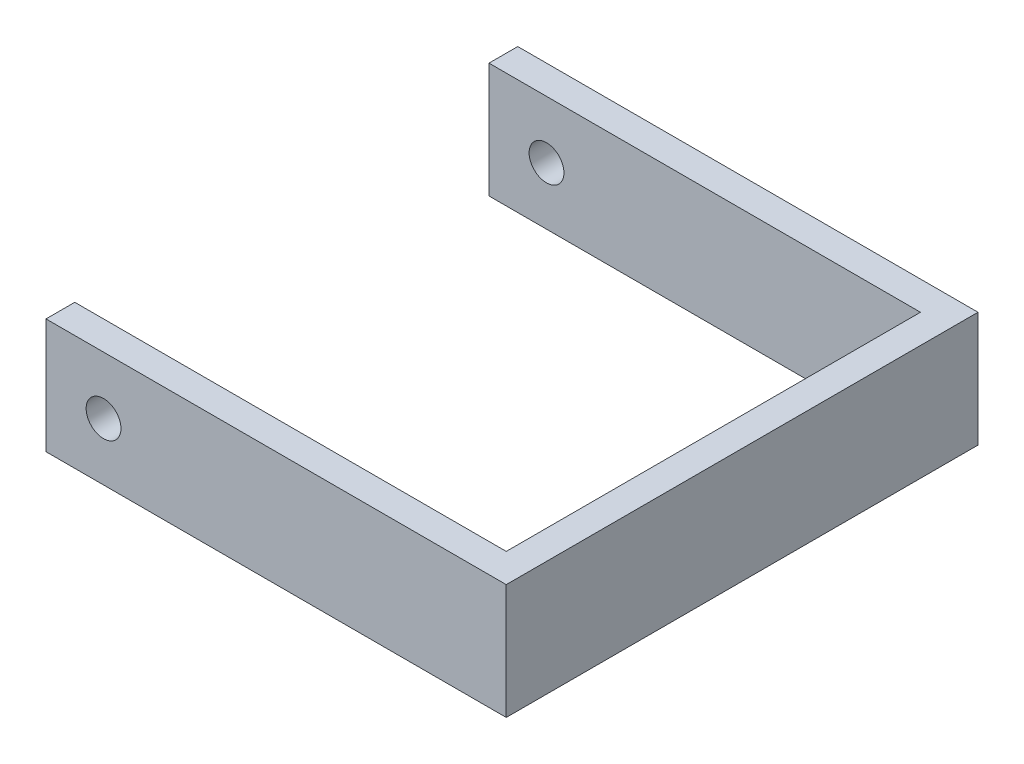
ISO-10303-21;
HEADER;
FILE_DESCRIPTION(('STEP AP214'),'2;1');
FILE_NAME('part.step','',(''),(''),'','','');
FILE_SCHEMA(('AUTOMOTIVE_DESIGN { 1 0 10303 214 1 1 1 1 }'));
ENDSEC;
DATA;
#1=APPLICATION_CONTEXT('core data for automotive mechanical design processes');
#2=APPLICATION_PROTOCOL_DEFINITION('international standard','automotive_design',2000,#1);
#3=PRODUCT_CONTEXT('',#1,'mechanical');
#4=PRODUCT('Part','Part','',(#3));
#5=PRODUCT_RELATED_PRODUCT_CATEGORY('part','',(#4));
#6=PRODUCT_DEFINITION_FORMATION('','',#4);
#7=PRODUCT_DEFINITION_CONTEXT('part definition',#1,'design');
#8=PRODUCT_DEFINITION('design','',#6,#7);
#9=PRODUCT_DEFINITION_SHAPE('','',#8);
#10=(LENGTH_UNIT() NAMED_UNIT(*) SI_UNIT(.MILLI.,.METRE.));
#11=(NAMED_UNIT(*) PLANE_ANGLE_UNIT() SI_UNIT($,.RADIAN.));
#12=(NAMED_UNIT(*) SI_UNIT($,.STERADIAN.) SOLID_ANGLE_UNIT());
#13=UNCERTAINTY_MEASURE_WITH_UNIT(LENGTH_MEASURE(1.E-05),#10,'distance_accuracy_value','');
#14=(GEOMETRIC_REPRESENTATION_CONTEXT(3) GLOBAL_UNCERTAINTY_ASSIGNED_CONTEXT((#13)) GLOBAL_UNIT_ASSIGNED_CONTEXT((#10,
#11,#12)) REPRESENTATION_CONTEXT('',''));
#15=CARTESIAN_POINT('',(0.,0.,0.));
#16=DIRECTION('',(0.,0.,1.));
#17=DIRECTION('',(1.,0.,0.));
#18=AXIS2_PLACEMENT_3D('',#15,#16,#17);
#19=CARTESIAN_POINT('',(-53.,20.,-36.));
#20=DIRECTION('',(1.,0.,0.));
#21=DIRECTION('',(0.,0.,-1.));
#22=AXIS2_PLACEMENT_3D('',#19,#20,#21);
#23=PLANE('',#22);
#24=DIRECTION('',(0.,0.,1.));
#25=VECTOR('',#24,1.);
#26=CARTESIAN_POINT('',(-53.,0.,-36.));
#27=LINE('',#26,#25);
#28=CARTESIAN_POINT('',(-53.,0.,-41.));
#29=VERTEX_POINT('',#28);
#30=CARTESIAN_POINT('',(-53.,0.,-36.));
#31=VERTEX_POINT('',#30);
#32=EDGE_CURVE('E129',#29,#31,#27,.T.);
#33=ORIENTED_EDGE('',*,*,#32,.T.);
#34=DIRECTION('',(0.,-1.,0.));
#35=VECTOR('',#34,1.);
#36=CARTESIAN_POINT('',(-53.,20.,-36.));
#37=LINE('',#36,#35);
#38=CARTESIAN_POINT('',(-53.,20.,-36.));
#39=VERTEX_POINT('',#38);
#40=EDGE_CURVE('E11',#39,#31,#37,.T.);
#41=ORIENTED_EDGE('',*,*,#40,.F.);
#42=DIRECTION('',(0.,0.,1.));
#43=VECTOR('',#42,1.);
#44=CARTESIAN_POINT('',(-53.,20.,-36.));
#45=LINE('',#44,#43);
#46=CARTESIAN_POINT('',(-53.,20.,-41.));
#47=VERTEX_POINT('',#46);
#48=EDGE_CURVE('E144',#47,#39,#45,.T.);
#49=ORIENTED_EDGE('',*,*,#48,.F.);
#50=DIRECTION('',(0.,-1.,0.));
#51=VECTOR('',#50,1.);
#52=CARTESIAN_POINT('',(-53.,20.,-41.));
#53=LINE('',#52,#51);
#54=EDGE_CURVE('E125',#47,#29,#53,.T.);
#55=ORIENTED_EDGE('',*,*,#54,.T.);
#56=EDGE_LOOP('',(#33,#41,#49,#55));
#57=FACE_BOUND('',#56,.T.);
#58=ADVANCED_FACE('F33',(#57),#23,.F.);
#59=CARTESIAN_POINT('',(22.,20.,-36.));
#60=DIRECTION('',(0.,0.,-1.));
#61=DIRECTION('',(-1.,0.,0.));
#62=AXIS2_PLACEMENT_3D('',#59,#60,#61);
#63=PLANE('',#62);
#64=CARTESIAN_POINT('',(-43.,10.,-36.));
#65=DIRECTION('',(0.,0.,-1.));
#66=DIRECTION('',(-1.,0.,0.));
#67=AXIS2_PLACEMENT_3D('',#64,#65,#66);
#68=CIRCLE('',#67,3.025);
#69=CARTESIAN_POINT('',(-46.025,10.,-36.));
#70=VERTEX_POINT('',#69);
#71=EDGE_CURVE('E182',#70,#70,#68,.F.);
#72=ORIENTED_EDGE('',*,*,#71,.F.);
#73=EDGE_LOOP('',(#72));
#74=FACE_BOUND('',#73,.T.);
#75=DIRECTION('',(1.,0.,0.));
#76=VECTOR('',#75,1.);
#77=CARTESIAN_POINT('',(22.,0.,-36.));
#78=LINE('',#77,#76);
#79=CARTESIAN_POINT('',(22.,0.,-36.));
#80=VERTEX_POINT('',#79);
#81=EDGE_CURVE('E132',#31,#80,#78,.T.);
#82=ORIENTED_EDGE('',*,*,#81,.T.);
#83=DIRECTION('',(0.,-1.,0.));
#84=VECTOR('',#83,1.);
#85=CARTESIAN_POINT('',(22.,20.,-36.));
#86=LINE('',#85,#84);
#87=CARTESIAN_POINT('',(22.,20.,-36.));
#88=VERTEX_POINT('',#87);
#89=EDGE_CURVE('E41',#88,#80,#86,.T.);
#90=ORIENTED_EDGE('',*,*,#89,.F.);
#91=DIRECTION('',(1.,0.,0.));
#92=VECTOR('',#91,1.);
#93=CARTESIAN_POINT('',(22.,20.,-36.));
#94=LINE('',#93,#92);
#95=EDGE_CURVE('E92',#39,#88,#94,.T.);
#96=ORIENTED_EDGE('',*,*,#95,.F.);
#97=ORIENTED_EDGE('',*,*,#40,.T.);
#98=EDGE_LOOP('',(#82,#90,#96,#97));
#99=FACE_BOUND('',#98,.T.);
#100=ADVANCED_FACE('F198',(#74,#99),#63,.F.);
#101=CARTESIAN_POINT('',(22.,20.,36.));
#102=DIRECTION('',(1.,0.,0.));
#103=DIRECTION('',(0.,0.,-1.));
#104=AXIS2_PLACEMENT_3D('',#101,#102,#103);
#105=PLANE('',#104);
#106=DIRECTION('',(0.,0.,1.));
#107=VECTOR('',#106,1.);
#108=CARTESIAN_POINT('',(22.,0.,36.));
#109=LINE('',#108,#107);
#110=CARTESIAN_POINT('',(22.,0.,36.));
#111=VERTEX_POINT('',#110);
#112=EDGE_CURVE('E135',#80,#111,#109,.T.);
#113=ORIENTED_EDGE('',*,*,#112,.T.);
#114=DIRECTION('',(0.,-1.,0.));
#115=VECTOR('',#114,1.);
#116=CARTESIAN_POINT('',(22.,20.,36.));
#117=LINE('',#116,#115);
#118=CARTESIAN_POINT('',(22.,20.,36.));
#119=VERTEX_POINT('',#118);
#120=EDGE_CURVE('E151',#119,#111,#117,.T.);
#121=ORIENTED_EDGE('',*,*,#120,.F.);
#122=DIRECTION('',(0.,0.,1.));
#123=VECTOR('',#122,1.);
#124=CARTESIAN_POINT('',(22.,20.,36.));
#125=LINE('',#124,#123);
#126=EDGE_CURVE('E159',#88,#119,#125,.T.);
#127=ORIENTED_EDGE('',*,*,#126,.F.);
#128=ORIENTED_EDGE('',*,*,#89,.T.);
#129=EDGE_LOOP('',(#113,#121,#127,#128));
#130=FACE_BOUND('',#129,.T.);
#131=ADVANCED_FACE('F157',(#130),#105,.F.);
#132=CARTESIAN_POINT('',(-53.,20.,36.));
#133=DIRECTION('',(0.,0.,1.));
#134=DIRECTION('',(1.,0.,0.));
#135=AXIS2_PLACEMENT_3D('',#132,#133,#134);
#136=PLANE('',#135);
#137=CARTESIAN_POINT('',(-43.,10.,36.));
#138=DIRECTION('',(0.,0.,1.));
#139=DIRECTION('',(1.,0.,0.));
#140=AXIS2_PLACEMENT_3D('',#137,#138,#139);
#141=CIRCLE('',#140,3.025);
#142=CARTESIAN_POINT('',(-39.975,10.,36.));
#143=VERTEX_POINT('',#142);
#144=EDGE_CURVE('E133',#143,#143,#141,.F.);
#145=ORIENTED_EDGE('',*,*,#144,.F.);
#146=EDGE_LOOP('',(#145));
#147=FACE_BOUND('',#146,.T.);
#148=DIRECTION('',(-1.,0.,0.));
#149=VECTOR('',#148,1.);
#150=CARTESIAN_POINT('',(-53.,0.,36.));
#151=LINE('',#150,#149);
#152=CARTESIAN_POINT('',(-53.,0.,36.));
#153=VERTEX_POINT('',#152);
#154=EDGE_CURVE('E137',#111,#153,#151,.T.);
#155=ORIENTED_EDGE('',*,*,#154,.T.);
#156=DIRECTION('',(0.,-1.,0.));
#157=VECTOR('',#156,1.);
#158=CARTESIAN_POINT('',(-53.,20.,36.));
#159=LINE('',#158,#157);
#160=CARTESIAN_POINT('',(-53.,20.,36.));
#161=VERTEX_POINT('',#160);
#162=EDGE_CURVE('E148',#161,#153,#159,.T.);
#163=ORIENTED_EDGE('',*,*,#162,.F.);
#164=DIRECTION('',(-1.,0.,0.));
#165=VECTOR('',#164,1.);
#166=CARTESIAN_POINT('',(-53.,20.,36.));
#167=LINE('',#166,#165);
#168=EDGE_CURVE('E171',#119,#161,#167,.T.);
#169=ORIENTED_EDGE('',*,*,#168,.F.);
#170=ORIENTED_EDGE('',*,*,#120,.T.);
#171=EDGE_LOOP('',(#155,#163,#169,#170));
#172=FACE_BOUND('',#171,.T.);
#173=ADVANCED_FACE('F167',(#147,#172),#136,.F.);
#174=CARTESIAN_POINT('',(-53.,20.,41.));
#175=DIRECTION('',(1.,0.,0.));
#176=DIRECTION('',(0.,0.,-1.));
#177=AXIS2_PLACEMENT_3D('',#174,#175,#176);
#178=PLANE('',#177);
#179=DIRECTION('',(0.,0.,1.));
#180=VECTOR('',#179,1.);
#181=CARTESIAN_POINT('',(-53.,0.,41.));
#182=LINE('',#181,#180);
#183=CARTESIAN_POINT('',(-53.,0.,41.));
#184=VERTEX_POINT('',#183);
#185=EDGE_CURVE('E139',#153,#184,#182,.T.);
#186=ORIENTED_EDGE('',*,*,#185,.T.);
#187=DIRECTION('',(0.,-1.,0.));
#188=VECTOR('',#187,1.);
#189=CARTESIAN_POINT('',(-53.,20.,41.));
#190=LINE('',#189,#188);
#191=CARTESIAN_POINT('',(-53.,20.,41.));
#192=VERTEX_POINT('',#191);
#193=EDGE_CURVE('E120',#192,#184,#190,.T.);
#194=ORIENTED_EDGE('',*,*,#193,.F.);
#195=DIRECTION('',(0.,0.,1.));
#196=VECTOR('',#195,1.);
#197=CARTESIAN_POINT('',(-53.,20.,41.));
#198=LINE('',#197,#196);
#199=EDGE_CURVE('E111',#161,#192,#198,.T.);
#200=ORIENTED_EDGE('',*,*,#199,.F.);
#201=ORIENTED_EDGE('',*,*,#162,.T.);
#202=EDGE_LOOP('',(#186,#194,#200,#201));
#203=FACE_BOUND('',#202,.T.);
#204=ADVANCED_FACE('F170',(#203),#178,.F.);
#205=CARTESIAN_POINT('',(27.,20.,41.));
#206=DIRECTION('',(0.,0.,-1.));
#207=DIRECTION('',(-1.,0.,0.));
#208=AXIS2_PLACEMENT_3D('',#205,#206,#207);
#209=PLANE('',#208);
#210=CARTESIAN_POINT('',(-43.,10.,41.));
#211=DIRECTION('',(0.,0.,1.));
#212=DIRECTION('',(1.,0.,0.));
#213=AXIS2_PLACEMENT_3D('',#210,#211,#212);
#214=CIRCLE('',#213,3.025);
#215=CARTESIAN_POINT('',(-39.975,10.,41.));
#216=VERTEX_POINT('',#215);
#217=EDGE_CURVE('E179',#216,#216,#214,.T.);
#218=ORIENTED_EDGE('',*,*,#217,.F.);
#219=EDGE_LOOP('',(#218));
#220=FACE_BOUND('',#219,.T.);
#221=DIRECTION('',(1.,0.,0.));
#222=VECTOR('',#221,1.);
#223=CARTESIAN_POINT('',(27.,0.,41.));
#224=LINE('',#223,#222);
#225=CARTESIAN_POINT('',(27.,0.,41.));
#226=VERTEX_POINT('',#225);
#227=EDGE_CURVE('E119',#184,#226,#224,.T.);
#228=ORIENTED_EDGE('',*,*,#227,.T.);
#229=DIRECTION('',(0.,-1.,0.));
#230=VECTOR('',#229,1.);
#231=CARTESIAN_POINT('',(27.,20.,41.));
#232=LINE('',#231,#230);
#233=CARTESIAN_POINT('',(27.,20.,41.));
#234=VERTEX_POINT('',#233);
#235=EDGE_CURVE('E116',#234,#226,#232,.T.);
#236=ORIENTED_EDGE('',*,*,#235,.F.);
#237=DIRECTION('',(1.,0.,0.));
#238=VECTOR('',#237,1.);
#239=CARTESIAN_POINT('',(27.,20.,41.));
#240=LINE('',#239,#238);
#241=EDGE_CURVE('E105',#192,#234,#240,.T.);
#242=ORIENTED_EDGE('',*,*,#241,.F.);
#243=ORIENTED_EDGE('',*,*,#193,.T.);
#244=EDGE_LOOP('',(#228,#236,#242,#243));
#245=FACE_BOUND('',#244,.T.);
#246=ADVANCED_FACE('F117',(#220,#245),#209,.F.);
#247=CARTESIAN_POINT('',(27.,20.,-41.));
#248=DIRECTION('',(-1.,0.,0.));
#249=DIRECTION('',(0.,0.,1.));
#250=AXIS2_PLACEMENT_3D('',#247,#248,#249);
#251=PLANE('',#250);
#252=DIRECTION('',(0.,0.,-1.));
#253=VECTOR('',#252,1.);
#254=CARTESIAN_POINT('',(27.,0.,-41.));
#255=LINE('',#254,#253);
#256=CARTESIAN_POINT('',(27.,0.,-41.));
#257=VERTEX_POINT('',#256);
#258=EDGE_CURVE('E78',#226,#257,#255,.T.);
#259=ORIENTED_EDGE('',*,*,#258,.T.);
#260=DIRECTION('',(0.,-1.,0.));
#261=VECTOR('',#260,1.);
#262=CARTESIAN_POINT('',(27.,20.,-41.));
#263=LINE('',#262,#261);
#264=CARTESIAN_POINT('',(27.,20.,-41.));
#265=VERTEX_POINT('',#264);
#266=EDGE_CURVE('E121',#265,#257,#263,.T.);
#267=ORIENTED_EDGE('',*,*,#266,.F.);
#268=DIRECTION('',(0.,0.,-1.));
#269=VECTOR('',#268,1.);
#270=CARTESIAN_POINT('',(27.,20.,-41.));
#271=LINE('',#270,#269);
#272=EDGE_CURVE('E109',#234,#265,#271,.T.);
#273=ORIENTED_EDGE('',*,*,#272,.F.);
#274=ORIENTED_EDGE('',*,*,#235,.T.);
#275=EDGE_LOOP('',(#259,#267,#273,#274));
#276=FACE_BOUND('',#275,.T.);
#277=ADVANCED_FACE('F123',(#276),#251,.F.);
#278=CARTESIAN_POINT('',(-53.,20.,-41.));
#279=DIRECTION('',(0.,0.,1.));
#280=DIRECTION('',(1.,0.,0.));
#281=AXIS2_PLACEMENT_3D('',#278,#279,#280);
#282=PLANE('',#281);
#283=CARTESIAN_POINT('',(-43.,10.,-41.));
#284=DIRECTION('',(0.,0.,1.));
#285=DIRECTION('',(1.,0.,0.));
#286=AXIS2_PLACEMENT_3D('',#283,#284,#285);
#287=CIRCLE('',#286,3.025);
#288=CARTESIAN_POINT('',(-39.975,10.,-41.));
#289=VERTEX_POINT('',#288);
#290=EDGE_CURVE('E185',#289,#289,#287,.T.);
#291=ORIENTED_EDGE('',*,*,#290,.T.);
#292=EDGE_LOOP('',(#291));
#293=FACE_BOUND('',#292,.T.);
#294=DIRECTION('',(-1.,0.,0.));
#295=VECTOR('',#294,1.);
#296=CARTESIAN_POINT('',(-53.,0.,-41.));
#297=LINE('',#296,#295);
#298=EDGE_CURVE('E84',#257,#29,#297,.T.);
#299=ORIENTED_EDGE('',*,*,#298,.T.);
#300=ORIENTED_EDGE('',*,*,#54,.F.);
#301=DIRECTION('',(-1.,0.,0.));
#302=VECTOR('',#301,1.);
#303=CARTESIAN_POINT('',(-53.,20.,-41.));
#304=LINE('',#303,#302);
#305=EDGE_CURVE('E49',#265,#47,#304,.T.);
#306=ORIENTED_EDGE('',*,*,#305,.F.);
#307=ORIENTED_EDGE('',*,*,#266,.T.);
#308=EDGE_LOOP('',(#299,#300,#306,#307));
#309=FACE_BOUND('',#308,.T.);
#310=ADVANCED_FACE('F189',(#293,#309),#282,.F.);
#311=CARTESIAN_POINT('',(0.,20.,0.));
#312=DIRECTION('',(0.,-1.,0.));
#313=DIRECTION('',(0.,0.,-1.));
#314=AXIS2_PLACEMENT_3D('',#311,#312,#313);
#315=PLANE('',#314);
#316=ORIENTED_EDGE('',*,*,#48,.T.);
#317=ORIENTED_EDGE('',*,*,#95,.T.);
#318=ORIENTED_EDGE('',*,*,#126,.T.);
#319=ORIENTED_EDGE('',*,*,#168,.T.);
#320=ORIENTED_EDGE('',*,*,#199,.T.);
#321=ORIENTED_EDGE('',*,*,#241,.T.);
#322=ORIENTED_EDGE('',*,*,#272,.T.);
#323=ORIENTED_EDGE('',*,*,#305,.T.);
#324=EDGE_LOOP('',(#316,#317,#318,#319,#320,#321,#322,#323));
#325=FACE_BOUND('',#324,.T.);
#326=ADVANCED_FACE('F107',(#325),#315,.F.);
#327=CARTESIAN_POINT('',(0.,0.,0.));
#328=DIRECTION('',(0.,-1.,0.));
#329=DIRECTION('',(0.,0.,-1.));
#330=AXIS2_PLACEMENT_3D('',#327,#328,#329);
#331=PLANE('',#330);
#332=ORIENTED_EDGE('',*,*,#32,.F.);
#333=ORIENTED_EDGE('',*,*,#298,.F.);
#334=ORIENTED_EDGE('',*,*,#258,.F.);
#335=ORIENTED_EDGE('',*,*,#227,.F.);
#336=ORIENTED_EDGE('',*,*,#185,.F.);
#337=ORIENTED_EDGE('',*,*,#154,.F.);
#338=ORIENTED_EDGE('',*,*,#112,.F.);
#339=ORIENTED_EDGE('',*,*,#81,.F.);
#340=EDGE_LOOP('',(#332,#333,#334,#335,#336,#337,#338,#339));
#341=FACE_BOUND('',#340,.T.);
#342=ADVANCED_FACE('F163',(#341),#331,.T.);
#343=CARTESIAN_POINT('',(-43.,10.,27.4440079476428));
#344=DIRECTION('',(0.,0.,1.));
#345=DIRECTION('',(1.,0.,0.));
#346=AXIS2_PLACEMENT_3D('',#343,#344,#345);
#347=CYLINDRICAL_SURFACE('',#346,3.025);
#348=ORIENTED_EDGE('',*,*,#144,.T.);
#349=EDGE_LOOP('',(#348));
#350=FACE_BOUND('',#349,.T.);
#351=ORIENTED_EDGE('',*,*,#217,.T.);
#352=EDGE_LOOP('',(#351));
#353=FACE_BOUND('',#352,.T.);
#354=ADVANCED_FACE('F194',(#350,#353),#347,.F.);
#355=CARTESIAN_POINT('',(-43.,10.,44.5559920523572));
#356=DIRECTION('',(0.,0.,-1.));
#357=DIRECTION('',(-1.,0.,0.));
#358=AXIS2_PLACEMENT_3D('',#355,#356,#357);
#359=CYLINDRICAL_SURFACE('',#358,3.025);
#360=ORIENTED_EDGE('',*,*,#290,.F.);
#361=EDGE_LOOP('',(#360));
#362=FACE_BOUND('',#361,.T.);
#363=ORIENTED_EDGE('',*,*,#71,.T.);
#364=EDGE_LOOP('',(#363));
#365=FACE_BOUND('',#364,.T.);
#366=ADVANCED_FACE('F191',(#362,#365),#359,.F.);
#367=CLOSED_SHELL('',(#58,#100,#131,#173,#204,#246,#277,#310,#326,#342,#354,#366));
#368=MANIFOLD_SOLID_BREP('B2',#367);
#369=ADVANCED_BREP_SHAPE_REPRESENTATION('',(#18,#368),#14);
#370=SHAPE_DEFINITION_REPRESENTATION(#9,#369);
ENDSEC;
END-ISO-10303-21;
